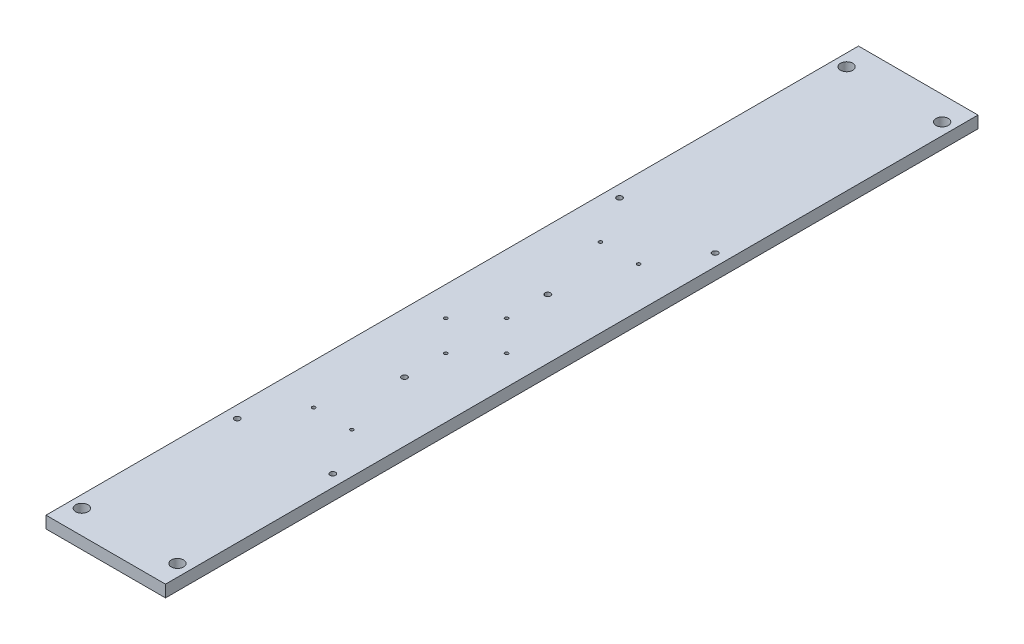
ISO-10303-21;
HEADER;
FILE_DESCRIPTION(('STEP AP214'),'2;1');
FILE_NAME('part.step','',(''),(''),'','','');
FILE_SCHEMA(('AUTOMOTIVE_DESIGN { 1 0 10303 214 1 1 1 1 }'));
ENDSEC;
DATA;
#1=APPLICATION_CONTEXT('core data for automotive mechanical design processes');
#2=APPLICATION_PROTOCOL_DEFINITION('international standard','automotive_design',2000,#1);
#3=PRODUCT_CONTEXT('',#1,'mechanical');
#4=PRODUCT('Part','Part','',(#3));
#5=PRODUCT_RELATED_PRODUCT_CATEGORY('part','',(#4));
#6=PRODUCT_DEFINITION_FORMATION('','',#4);
#7=PRODUCT_DEFINITION_CONTEXT('part definition',#1,'design');
#8=PRODUCT_DEFINITION('design','',#6,#7);
#9=PRODUCT_DEFINITION_SHAPE('','',#8);
#10=(LENGTH_UNIT() NAMED_UNIT(*) SI_UNIT(.MILLI.,.METRE.));
#11=(NAMED_UNIT(*) PLANE_ANGLE_UNIT() SI_UNIT($,.RADIAN.));
#12=(NAMED_UNIT(*) SI_UNIT($,.STERADIAN.) SOLID_ANGLE_UNIT());
#13=UNCERTAINTY_MEASURE_WITH_UNIT(LENGTH_MEASURE(1.E-05),#10,'distance_accuracy_value','');
#14=(GEOMETRIC_REPRESENTATION_CONTEXT(3) GLOBAL_UNCERTAINTY_ASSIGNED_CONTEXT((#13)) GLOBAL_UNIT_ASSIGNED_CONTEXT((#10,
#11,#12)) REPRESENTATION_CONTEXT('',''));
#15=CARTESIAN_POINT('',(0.,0.,0.));
#16=DIRECTION('',(0.,0.,1.));
#17=DIRECTION('',(1.,0.,0.));
#18=AXIS2_PLACEMENT_3D('',#15,#16,#17);
#19=CARTESIAN_POINT('',(0.,6.35,0.));
#20=DIRECTION('',(1.,0.,0.));
#21=DIRECTION('',(0.,0.,-1.));
#22=AXIS2_PLACEMENT_3D('',#19,#20,#21);
#23=PLANE('',#22);
#24=DIRECTION('',(0.,0.,1.));
#25=VECTOR('',#24,1.);
#26=CARTESIAN_POINT('',(0.,0.,0.));
#27=LINE('',#26,#25);
#28=CARTESIAN_POINT('',(0.,0.,-431.8));
#29=VERTEX_POINT('',#28);
#30=CARTESIAN_POINT('',(0.,0.,0.));
#31=VERTEX_POINT('',#30);
#32=EDGE_CURVE('E96',#29,#31,#27,.T.);
#33=ORIENTED_EDGE('',*,*,#32,.T.);
#34=DIRECTION('',(0.,-1.,0.));
#35=VECTOR('',#34,1.);
#36=CARTESIAN_POINT('',(0.,6.35,0.));
#37=LINE('',#36,#35);
#38=CARTESIAN_POINT('',(0.,6.35,0.));
#39=VERTEX_POINT('',#38);
#40=EDGE_CURVE('E11',#39,#31,#37,.T.);
#41=ORIENTED_EDGE('',*,*,#40,.F.);
#42=DIRECTION('',(0.,0.,1.));
#43=VECTOR('',#42,1.);
#44=CARTESIAN_POINT('',(0.,6.35,0.));
#45=LINE('',#44,#43);
#46=CARTESIAN_POINT('',(0.,6.35,-431.8));
#47=VERTEX_POINT('',#46);
#48=EDGE_CURVE('E84',#47,#39,#45,.T.);
#49=ORIENTED_EDGE('',*,*,#48,.F.);
#50=DIRECTION('',(0.,-1.,0.));
#51=VECTOR('',#50,1.);
#52=CARTESIAN_POINT('',(0.,6.35,-431.8));
#53=LINE('',#52,#51);
#54=EDGE_CURVE('E92',#47,#29,#53,.T.);
#55=ORIENTED_EDGE('',*,*,#54,.T.);
#56=EDGE_LOOP('',(#33,#41,#49,#55));
#57=FACE_BOUND('',#56,.T.);
#58=ADVANCED_FACE('F33',(#57),#23,.F.);
#59=CARTESIAN_POINT('',(0.,6.35,0.));
#60=DIRECTION('',(0.,0.,-1.));
#61=DIRECTION('',(-1.,0.,0.));
#62=AXIS2_PLACEMENT_3D('',#59,#60,#61);
#63=PLANE('',#62);
#64=DIRECTION('',(1.,0.,0.));
#65=VECTOR('',#64,1.);
#66=CARTESIAN_POINT('',(0.,0.,0.));
#67=LINE('',#66,#65);
#68=CARTESIAN_POINT('',(63.5,0.,0.));
#69=VERTEX_POINT('',#68);
#70=EDGE_CURVE('E88',#31,#69,#67,.T.);
#71=ORIENTED_EDGE('',*,*,#70,.T.);
#72=DIRECTION('',(0.,-1.,0.));
#73=VECTOR('',#72,1.);
#74=CARTESIAN_POINT('',(63.5,6.35,0.));
#75=LINE('',#74,#73);
#76=CARTESIAN_POINT('',(63.5,6.35,0.));
#77=VERTEX_POINT('',#76);
#78=EDGE_CURVE('E41',#77,#69,#75,.T.);
#79=ORIENTED_EDGE('',*,*,#78,.F.);
#80=DIRECTION('',(1.,0.,0.));
#81=VECTOR('',#80,1.);
#82=CARTESIAN_POINT('',(0.,6.35,0.));
#83=LINE('',#82,#81);
#84=EDGE_CURVE('E79',#39,#77,#83,.T.);
#85=ORIENTED_EDGE('',*,*,#84,.F.);
#86=ORIENTED_EDGE('',*,*,#40,.T.);
#87=EDGE_LOOP('',(#71,#79,#85,#86));
#88=FACE_BOUND('',#87,.T.);
#89=ADVANCED_FACE('F87',(#88),#63,.F.);
#90=CARTESIAN_POINT('',(63.5,6.35,0.));
#91=DIRECTION('',(-1.,0.,0.));
#92=DIRECTION('',(0.,0.,1.));
#93=AXIS2_PLACEMENT_3D('',#90,#91,#92);
#94=PLANE('',#93);
#95=DIRECTION('',(0.,0.,-1.));
#96=VECTOR('',#95,1.);
#97=CARTESIAN_POINT('',(63.5,0.,0.));
#98=LINE('',#97,#96);
#99=CARTESIAN_POINT('',(63.5,0.,-431.8));
#100=VERTEX_POINT('',#99);
#101=EDGE_CURVE('E66',#69,#100,#98,.T.);
#102=ORIENTED_EDGE('',*,*,#101,.T.);
#103=DIRECTION('',(0.,-1.,0.));
#104=VECTOR('',#103,1.);
#105=CARTESIAN_POINT('',(63.5,6.35,-431.8));
#106=LINE('',#105,#104);
#107=CARTESIAN_POINT('',(63.5,6.35,-431.8));
#108=VERTEX_POINT('',#107);
#109=EDGE_CURVE('E89',#108,#100,#106,.T.);
#110=ORIENTED_EDGE('',*,*,#109,.F.);
#111=DIRECTION('',(0.,0.,-1.));
#112=VECTOR('',#111,1.);
#113=CARTESIAN_POINT('',(63.5,6.35,0.));
#114=LINE('',#113,#112);
#115=EDGE_CURVE('E82',#77,#108,#114,.T.);
#116=ORIENTED_EDGE('',*,*,#115,.F.);
#117=ORIENTED_EDGE('',*,*,#78,.T.);
#118=EDGE_LOOP('',(#102,#110,#116,#117));
#119=FACE_BOUND('',#118,.T.);
#120=ADVANCED_FACE('F90',(#119),#94,.F.);
#121=CARTESIAN_POINT('',(0.,6.35,-431.8));
#122=DIRECTION('',(0.,0.,1.));
#123=DIRECTION('',(1.,0.,0.));
#124=AXIS2_PLACEMENT_3D('',#121,#122,#123);
#125=PLANE('',#124);
#126=DIRECTION('',(-1.,0.,0.));
#127=VECTOR('',#126,1.);
#128=CARTESIAN_POINT('',(0.,0.,-431.8));
#129=LINE('',#128,#127);
#130=EDGE_CURVE('E72',#100,#29,#129,.T.);
#131=ORIENTED_EDGE('',*,*,#130,.T.);
#132=ORIENTED_EDGE('',*,*,#54,.F.);
#133=DIRECTION('',(-1.,0.,0.));
#134=VECTOR('',#133,1.);
#135=CARTESIAN_POINT('',(0.,6.35,-431.8));
#136=LINE('',#135,#134);
#137=EDGE_CURVE('E49',#108,#47,#136,.T.);
#138=ORIENTED_EDGE('',*,*,#137,.F.);
#139=ORIENTED_EDGE('',*,*,#109,.T.);
#140=EDGE_LOOP('',(#131,#132,#138,#139));
#141=FACE_BOUND('',#140,.T.);
#142=ADVANCED_FACE('F104',(#141),#125,.F.);
#143=CARTESIAN_POINT('',(0.,6.35,0.));
#144=DIRECTION('',(0.,-1.,0.));
#145=DIRECTION('',(0.,0.,-1.));
#146=AXIS2_PLACEMENT_3D('',#143,#144,#145);
#147=PLANE('',#146);
#148=CARTESIAN_POINT('',(15.58544,6.35,-196.85));
#149=DIRECTION('',(0.,1.,0.));
#150=DIRECTION('',(0.,0.,1.));
#151=AXIS2_PLACEMENT_3D('',#148,#149,#150);
#152=CIRCLE('',#151,0.889000000000006);
#153=CARTESIAN_POINT('',(15.58544,6.35,-195.961));
#154=VERTEX_POINT('',#153);
#155=EDGE_CURVE('E195',#154,#154,#152,.T.);
#156=ORIENTED_EDGE('',*,*,#155,.F.);
#157=EDGE_LOOP('',(#156));
#158=FACE_BOUND('',#157,.T.);
#159=CARTESIAN_POINT('',(21.59,6.35,-120.65));
#160=DIRECTION('',(0.,1.,0.));
#161=DIRECTION('',(0.,0.,-1.));
#162=AXIS2_PLACEMENT_3D('',#159,#160,#161);
#163=CIRCLE('',#162,0.888999999999988);
#164=CARTESIAN_POINT('',(21.59,6.35,-121.539));
#165=VERTEX_POINT('',#164);
#166=EDGE_CURVE('E196',#165,#165,#163,.T.);
#167=ORIENTED_EDGE('',*,*,#166,.F.);
#168=EDGE_LOOP('',(#167));
#169=FACE_BOUND('',#168,.T.);
#170=CARTESIAN_POINT('',(41.9099999999999,6.35,-120.65));
#171=DIRECTION('',(0.,1.,0.));
#172=DIRECTION('',(0.,0.,1.));
#173=AXIS2_PLACEMENT_3D('',#170,#171,#172);
#174=CIRCLE('',#173,0.888999999999985);
#175=CARTESIAN_POINT('',(41.9099999999999,6.35,-119.761));
#176=VERTEX_POINT('',#175);
#177=EDGE_CURVE('E202',#176,#176,#174,.T.);
#178=ORIENTED_EDGE('',*,*,#177,.F.);
#179=EDGE_LOOP('',(#178));
#180=FACE_BOUND('',#179,.T.);
#181=CARTESIAN_POINT('',(41.9099999999999,6.35,-273.05));
#182=DIRECTION('',(0.,1.,0.));
#183=DIRECTION('',(0.,0.,-1.));
#184=AXIS2_PLACEMENT_3D('',#181,#182,#183);
#185=CIRCLE('',#184,0.888999999999985);
#186=CARTESIAN_POINT('',(41.9099999999999,6.35,-273.939));
#187=VERTEX_POINT('',#186);
#188=EDGE_CURVE('E208',#187,#187,#185,.T.);
#189=ORIENTED_EDGE('',*,*,#188,.F.);
#190=EDGE_LOOP('',(#189));
#191=FACE_BOUND('',#190,.T.);
#192=CARTESIAN_POINT('',(31.7500000000053,6.35,-180.685439999995));
#193=DIRECTION('',(0.,1.,0.));
#194=DIRECTION('',(0.,0.,1.));
#195=AXIS2_PLACEMENT_3D('',#192,#193,#194);
#196=CIRCLE('',#195,0.88900000000002);
#197=CARTESIAN_POINT('',(31.7500000000053,6.35,-179.796439999994));
#198=VERTEX_POINT('',#197);
#199=EDGE_CURVE('E170',#198,#198,#196,.T.);
#200=ORIENTED_EDGE('',*,*,#199,.F.);
#201=EDGE_LOOP('',(#200));
#202=FACE_BOUND('',#201,.T.);
#203=CARTESIAN_POINT('',(47.914560000011,6.35,-196.85));
#204=DIRECTION('',(0.,1.,0.));
#205=DIRECTION('',(0.,0.,1.));
#206=AXIS2_PLACEMENT_3D('',#203,#204,#205);
#207=CIRCLE('',#206,0.889000000000006);
#208=CARTESIAN_POINT('',(47.914560000011,6.35,-195.961));
#209=VERTEX_POINT('',#208);
#210=EDGE_CURVE('E177',#209,#209,#207,.T.);
#211=ORIENTED_EDGE('',*,*,#210,.F.);
#212=EDGE_LOOP('',(#211));
#213=FACE_BOUND('',#212,.T.);
#214=CARTESIAN_POINT('',(31.7500000000055,6.35,-213.014560000005));
#215=DIRECTION('',(0.,1.,0.));
#216=DIRECTION('',(0.,0.,1.));
#217=AXIS2_PLACEMENT_3D('',#214,#215,#216);
#218=CIRCLE('',#217,0.888999999999993);
#219=CARTESIAN_POINT('',(31.7500000000055,6.35,-212.125560000005));
#220=VERTEX_POINT('',#219);
#221=EDGE_CURVE('E183',#220,#220,#218,.T.);
#222=ORIENTED_EDGE('',*,*,#221,.F.);
#223=EDGE_LOOP('',(#222));
#224=FACE_BOUND('',#223,.T.);
#225=CARTESIAN_POINT('',(21.59,6.35,-273.05));
#226=DIRECTION('',(0.,1.,0.));
#227=DIRECTION('',(0.,0.,1.));
#228=AXIS2_PLACEMENT_3D('',#225,#226,#227);
#229=CIRCLE('',#228,0.888999999999988);
#230=CARTESIAN_POINT('',(21.59,6.35,-272.161));
#231=VERTEX_POINT('',#230);
#232=EDGE_CURVE('E189',#231,#231,#229,.T.);
#233=ORIENTED_EDGE('',*,*,#232,.F.);
#234=EDGE_LOOP('',(#233));
#235=FACE_BOUND('',#234,.T.);
#236=CARTESIAN_POINT('',(57.1499999999999,6.35,-298.45));
#237=DIRECTION('',(0.,1.,0.));
#238=DIRECTION('',(0.,0.,-1.));
#239=AXIS2_PLACEMENT_3D('',#236,#237,#238);
#240=CIRCLE('',#239,1.47319999999999);
#241=CARTESIAN_POINT('',(57.1499999999999,6.35,-299.9232));
#242=VERTEX_POINT('',#241);
#243=EDGE_CURVE('E159',#242,#242,#240,.T.);
#244=ORIENTED_EDGE('',*,*,#243,.F.);
#245=EDGE_LOOP('',(#244));
#246=FACE_BOUND('',#245,.T.);
#247=CARTESIAN_POINT('',(57.1499999999999,6.35,-95.25));
#248=DIRECTION('',(0.,1.,0.));
#249=DIRECTION('',(0.,0.,1.));
#250=AXIS2_PLACEMENT_3D('',#247,#248,#249);
#251=CIRCLE('',#250,1.47319999999999);
#252=CARTESIAN_POINT('',(57.1499999999999,6.35,-93.7768));
#253=VERTEX_POINT('',#252);
#254=EDGE_CURVE('E153',#253,#253,#251,.T.);
#255=ORIENTED_EDGE('',*,*,#254,.F.);
#256=EDGE_LOOP('',(#255));
#257=FACE_BOUND('',#256,.T.);
#258=CARTESIAN_POINT('',(6.35,6.35,-95.25));
#259=DIRECTION('',(0.,1.,0.));
#260=DIRECTION('',(0.,0.,-1.));
#261=AXIS2_PLACEMENT_3D('',#258,#259,#260);
#262=CIRCLE('',#261,1.47319999999999);
#263=CARTESIAN_POINT('',(6.35,6.35,-96.7232));
#264=VERTEX_POINT('',#263);
#265=EDGE_CURVE('E147',#264,#264,#262,.T.);
#266=ORIENTED_EDGE('',*,*,#265,.F.);
#267=EDGE_LOOP('',(#266));
#268=FACE_BOUND('',#267,.T.);
#269=CARTESIAN_POINT('',(31.75,6.35,-234.95));
#270=DIRECTION('',(0.,1.,0.));
#271=DIRECTION('',(0.,0.,1.));
#272=AXIS2_PLACEMENT_3D('',#269,#270,#271);
#273=CIRCLE('',#272,1.47319999999998);
#274=CARTESIAN_POINT('',(31.75,6.35,-233.4768));
#275=VERTEX_POINT('',#274);
#276=EDGE_CURVE('E140',#275,#275,#273,.T.);
#277=ORIENTED_EDGE('',*,*,#276,.F.);
#278=EDGE_LOOP('',(#277));
#279=FACE_BOUND('',#278,.T.);
#280=CARTESIAN_POINT('',(31.75,6.35,-158.75));
#281=DIRECTION('',(0.,1.,0.));
#282=DIRECTION('',(0.,0.,-1.));
#283=AXIS2_PLACEMENT_3D('',#280,#281,#282);
#284=CIRCLE('',#283,1.47319999999998);
#285=CARTESIAN_POINT('',(31.75,6.35,-160.2232));
#286=VERTEX_POINT('',#285);
#287=EDGE_CURVE('E164',#286,#286,#284,.T.);
#288=ORIENTED_EDGE('',*,*,#287,.F.);
#289=EDGE_LOOP('',(#288));
#290=FACE_BOUND('',#289,.T.);
#291=CARTESIAN_POINT('',(6.35,6.35,-298.45));
#292=DIRECTION('',(0.,1.,0.));
#293=DIRECTION('',(0.,0.,1.));
#294=AXIS2_PLACEMENT_3D('',#291,#292,#293);
#295=CIRCLE('',#294,1.47319999999999);
#296=CARTESIAN_POINT('',(6.35,6.35,-296.9768));
#297=VERTEX_POINT('',#296);
#298=EDGE_CURVE('E134',#297,#297,#295,.T.);
#299=ORIENTED_EDGE('',*,*,#298,.F.);
#300=EDGE_LOOP('',(#299));
#301=FACE_BOUND('',#300,.T.);
#302=CARTESIAN_POINT('',(6.35,6.35,-12.7));
#303=DIRECTION('',(0.,1.,0.));
#304=DIRECTION('',(0.,0.,-1.));
#305=AXIS2_PLACEMENT_3D('',#302,#303,#304);
#306=CIRCLE('',#305,3.26390000000003);
#307=CARTESIAN_POINT('',(6.35,6.35,-15.9639));
#308=VERTEX_POINT('',#307);
#309=EDGE_CURVE('E116',#308,#308,#306,.T.);
#310=ORIENTED_EDGE('',*,*,#309,.F.);
#311=EDGE_LOOP('',(#310));
#312=FACE_BOUND('',#311,.T.);
#313=CARTESIAN_POINT('',(57.15,6.35,-12.7));
#314=DIRECTION('',(0.,1.,0.));
#315=DIRECTION('',(0.,0.,1.));
#316=AXIS2_PLACEMENT_3D('',#313,#314,#315);
#317=CIRCLE('',#316,3.26390000000003);
#318=CARTESIAN_POINT('',(57.15,6.35,-9.43609999999996));
#319=VERTEX_POINT('',#318);
#320=EDGE_CURVE('E123',#319,#319,#317,.T.);
#321=ORIENTED_EDGE('',*,*,#320,.F.);
#322=EDGE_LOOP('',(#321));
#323=FACE_BOUND('',#322,.T.);
#324=CARTESIAN_POINT('',(57.15,6.35,-419.1));
#325=DIRECTION('',(0.,1.,0.));
#326=DIRECTION('',(0.,0.,-1.));
#327=AXIS2_PLACEMENT_3D('',#324,#325,#326);
#328=CIRCLE('',#327,3.26390000000003);
#329=CARTESIAN_POINT('',(57.15,6.35,-422.3639));
#330=VERTEX_POINT('',#329);
#331=EDGE_CURVE('E129',#330,#330,#328,.T.);
#332=ORIENTED_EDGE('',*,*,#331,.F.);
#333=EDGE_LOOP('',(#332));
#334=FACE_BOUND('',#333,.T.);
#335=CARTESIAN_POINT('',(6.35,6.35,-419.1));
#336=DIRECTION('',(0.,1.,0.));
#337=DIRECTION('',(0.,0.,1.));
#338=AXIS2_PLACEMENT_3D('',#335,#336,#337);
#339=CIRCLE('',#338,3.26390000000003);
#340=CARTESIAN_POINT('',(6.35,6.35,-415.8361));
#341=VERTEX_POINT('',#340);
#342=EDGE_CURVE('E110',#341,#341,#339,.T.);
#343=ORIENTED_EDGE('',*,*,#342,.F.);
#344=EDGE_LOOP('',(#343));
#345=FACE_BOUND('',#344,.T.);
#346=ORIENTED_EDGE('',*,*,#48,.T.);
#347=ORIENTED_EDGE('',*,*,#84,.T.);
#348=ORIENTED_EDGE('',*,*,#115,.T.);
#349=ORIENTED_EDGE('',*,*,#137,.T.);
#350=EDGE_LOOP('',(#346,#347,#348,#349));
#351=FACE_BOUND('',#350,.T.);
#352=ADVANCED_FACE('F80',(#158,#169,#180,#191,#202,#213,#224,#235,#246,#257,#268,#279,#290,#301,
#312,#323,#334,#345,#351),#147,.F.);
#353=CARTESIAN_POINT('',(0.,0.,0.));
#354=DIRECTION('',(0.,-1.,0.));
#355=DIRECTION('',(0.,0.,-1.));
#356=AXIS2_PLACEMENT_3D('',#353,#354,#355);
#357=PLANE('',#356);
#358=CARTESIAN_POINT('',(15.58544,0.,-196.85));
#359=DIRECTION('',(0.,1.,0.));
#360=DIRECTION('',(0.,0.,1.));
#361=AXIS2_PLACEMENT_3D('',#358,#359,#360);
#362=CIRCLE('',#361,0.889000000000006);
#363=CARTESIAN_POINT('',(15.58544,0.,-195.961));
#364=VERTEX_POINT('',#363);
#365=EDGE_CURVE('E167',#364,#364,#362,.T.);
#366=ORIENTED_EDGE('',*,*,#365,.T.);
#367=EDGE_LOOP('',(#366));
#368=FACE_BOUND('',#367,.T.);
#369=CARTESIAN_POINT('',(21.59,0.,-120.65));
#370=DIRECTION('',(0.,1.,0.));
#371=DIRECTION('',(0.,0.,-1.));
#372=AXIS2_PLACEMENT_3D('',#369,#370,#371);
#373=CIRCLE('',#372,0.888999999999988);
#374=CARTESIAN_POINT('',(21.59,0.,-121.539));
#375=VERTEX_POINT('',#374);
#376=EDGE_CURVE('E199',#375,#375,#373,.T.);
#377=ORIENTED_EDGE('',*,*,#376,.T.);
#378=EDGE_LOOP('',(#377));
#379=FACE_BOUND('',#378,.T.);
#380=CARTESIAN_POINT('',(41.9099999999999,0.,-120.65));
#381=DIRECTION('',(0.,1.,0.));
#382=DIRECTION('',(0.,0.,1.));
#383=AXIS2_PLACEMENT_3D('',#380,#381,#382);
#384=CIRCLE('',#383,0.888999999999985);
#385=CARTESIAN_POINT('',(41.9099999999999,0.,-119.761));
#386=VERTEX_POINT('',#385);
#387=EDGE_CURVE('E205',#386,#386,#384,.T.);
#388=ORIENTED_EDGE('',*,*,#387,.T.);
#389=EDGE_LOOP('',(#388));
#390=FACE_BOUND('',#389,.T.);
#391=CARTESIAN_POINT('',(41.9099999999999,0.,-273.05));
#392=DIRECTION('',(0.,1.,0.));
#393=DIRECTION('',(0.,0.,-1.));
#394=AXIS2_PLACEMENT_3D('',#391,#392,#393);
#395=CIRCLE('',#394,0.888999999999985);
#396=CARTESIAN_POINT('',(41.9099999999999,0.,-273.939));
#397=VERTEX_POINT('',#396);
#398=EDGE_CURVE('E174',#397,#397,#395,.T.);
#399=ORIENTED_EDGE('',*,*,#398,.T.);
#400=EDGE_LOOP('',(#399));
#401=FACE_BOUND('',#400,.T.);
#402=CARTESIAN_POINT('',(31.7500000000053,0.,-180.685439999995));
#403=DIRECTION('',(0.,1.,0.));
#404=DIRECTION('',(0.,0.,1.));
#405=AXIS2_PLACEMENT_3D('',#402,#403,#404);
#406=CIRCLE('',#405,0.88900000000002);
#407=CARTESIAN_POINT('',(31.7500000000053,0.,-179.796439999994));
#408=VERTEX_POINT('',#407);
#409=EDGE_CURVE('E173',#408,#408,#406,.T.);
#410=ORIENTED_EDGE('',*,*,#409,.T.);
#411=EDGE_LOOP('',(#410));
#412=FACE_BOUND('',#411,.T.);
#413=CARTESIAN_POINT('',(47.914560000011,0.,-196.85));
#414=DIRECTION('',(0.,1.,0.));
#415=DIRECTION('',(0.,0.,1.));
#416=AXIS2_PLACEMENT_3D('',#413,#414,#415);
#417=CIRCLE('',#416,0.889000000000006);
#418=CARTESIAN_POINT('',(47.914560000011,0.,-195.961));
#419=VERTEX_POINT('',#418);
#420=EDGE_CURVE('E180',#419,#419,#417,.T.);
#421=ORIENTED_EDGE('',*,*,#420,.T.);
#422=EDGE_LOOP('',(#421));
#423=FACE_BOUND('',#422,.T.);
#424=CARTESIAN_POINT('',(31.7500000000055,0.,-213.014560000005));
#425=DIRECTION('',(0.,1.,0.));
#426=DIRECTION('',(0.,0.,1.));
#427=AXIS2_PLACEMENT_3D('',#424,#425,#426);
#428=CIRCLE('',#427,0.888999999999993);
#429=CARTESIAN_POINT('',(31.7500000000055,0.,-212.125560000005));
#430=VERTEX_POINT('',#429);
#431=EDGE_CURVE('E186',#430,#430,#428,.T.);
#432=ORIENTED_EDGE('',*,*,#431,.T.);
#433=EDGE_LOOP('',(#432));
#434=FACE_BOUND('',#433,.T.);
#435=CARTESIAN_POINT('',(21.59,0.,-273.05));
#436=DIRECTION('',(0.,1.,0.));
#437=DIRECTION('',(0.,0.,1.));
#438=AXIS2_PLACEMENT_3D('',#435,#436,#437);
#439=CIRCLE('',#438,0.888999999999988);
#440=CARTESIAN_POINT('',(21.59,0.,-272.161));
#441=VERTEX_POINT('',#440);
#442=EDGE_CURVE('E192',#441,#441,#439,.T.);
#443=ORIENTED_EDGE('',*,*,#442,.T.);
#444=EDGE_LOOP('',(#443));
#445=FACE_BOUND('',#444,.T.);
#446=CARTESIAN_POINT('',(57.1499999999999,0.,-298.45));
#447=DIRECTION('',(0.,1.,0.));
#448=DIRECTION('',(0.,0.,-1.));
#449=AXIS2_PLACEMENT_3D('',#446,#447,#448);
#450=CIRCLE('',#449,1.47319999999999);
#451=CARTESIAN_POINT('',(57.1499999999999,0.,-299.9232));
#452=VERTEX_POINT('',#451);
#453=EDGE_CURVE('E137',#452,#452,#450,.T.);
#454=ORIENTED_EDGE('',*,*,#453,.T.);
#455=EDGE_LOOP('',(#454));
#456=FACE_BOUND('',#455,.T.);
#457=CARTESIAN_POINT('',(57.1499999999999,0.,-95.25));
#458=DIRECTION('',(0.,1.,0.));
#459=DIRECTION('',(0.,0.,1.));
#460=AXIS2_PLACEMENT_3D('',#457,#458,#459);
#461=CIRCLE('',#460,1.47319999999999);
#462=CARTESIAN_POINT('',(57.1499999999999,0.,-93.7768));
#463=VERTEX_POINT('',#462);
#464=EDGE_CURVE('E156',#463,#463,#461,.T.);
#465=ORIENTED_EDGE('',*,*,#464,.T.);
#466=EDGE_LOOP('',(#465));
#467=FACE_BOUND('',#466,.T.);
#468=CARTESIAN_POINT('',(6.35,0.,-95.25));
#469=DIRECTION('',(0.,1.,0.));
#470=DIRECTION('',(0.,0.,-1.));
#471=AXIS2_PLACEMENT_3D('',#468,#469,#470);
#472=CIRCLE('',#471,1.47319999999999);
#473=CARTESIAN_POINT('',(6.35,0.,-96.7232));
#474=VERTEX_POINT('',#473);
#475=EDGE_CURVE('E150',#474,#474,#472,.T.);
#476=ORIENTED_EDGE('',*,*,#475,.T.);
#477=EDGE_LOOP('',(#476));
#478=FACE_BOUND('',#477,.T.);
#479=CARTESIAN_POINT('',(31.75,0.,-234.95));
#480=DIRECTION('',(0.,1.,0.));
#481=DIRECTION('',(0.,0.,1.));
#482=AXIS2_PLACEMENT_3D('',#479,#480,#481);
#483=CIRCLE('',#482,1.47319999999998);
#484=CARTESIAN_POINT('',(31.75,0.,-233.4768));
#485=VERTEX_POINT('',#484);
#486=EDGE_CURVE('E143',#485,#485,#483,.T.);
#487=ORIENTED_EDGE('',*,*,#486,.T.);
#488=EDGE_LOOP('',(#487));
#489=FACE_BOUND('',#488,.T.);
#490=CARTESIAN_POINT('',(31.75,0.,-158.75));
#491=DIRECTION('',(0.,1.,0.));
#492=DIRECTION('',(0.,0.,-1.));
#493=AXIS2_PLACEMENT_3D('',#490,#491,#492);
#494=CIRCLE('',#493,1.47319999999998);
#495=CARTESIAN_POINT('',(31.75,0.,-160.2232));
#496=VERTEX_POINT('',#495);
#497=EDGE_CURVE('E144',#496,#496,#494,.T.);
#498=ORIENTED_EDGE('',*,*,#497,.T.);
#499=EDGE_LOOP('',(#498));
#500=FACE_BOUND('',#499,.T.);
#501=CARTESIAN_POINT('',(6.35,0.,-298.45));
#502=DIRECTION('',(0.,1.,0.));
#503=DIRECTION('',(0.,0.,1.));
#504=AXIS2_PLACEMENT_3D('',#501,#502,#503);
#505=CIRCLE('',#504,1.47319999999999);
#506=CARTESIAN_POINT('',(6.35,0.,-296.9768));
#507=VERTEX_POINT('',#506);
#508=EDGE_CURVE('E120',#507,#507,#505,.T.);
#509=ORIENTED_EDGE('',*,*,#508,.T.);
#510=EDGE_LOOP('',(#509));
#511=FACE_BOUND('',#510,.T.);
#512=CARTESIAN_POINT('',(6.35,0.,-12.7));
#513=DIRECTION('',(0.,1.,0.));
#514=DIRECTION('',(0.,0.,-1.));
#515=AXIS2_PLACEMENT_3D('',#512,#513,#514);
#516=CIRCLE('',#515,3.26390000000003);
#517=CARTESIAN_POINT('',(6.35,0.,-15.9639));
#518=VERTEX_POINT('',#517);
#519=EDGE_CURVE('E119',#518,#518,#516,.T.);
#520=ORIENTED_EDGE('',*,*,#519,.T.);
#521=EDGE_LOOP('',(#520));
#522=FACE_BOUND('',#521,.T.);
#523=CARTESIAN_POINT('',(57.15,0.,-12.7));
#524=DIRECTION('',(0.,1.,0.));
#525=DIRECTION('',(0.,0.,1.));
#526=AXIS2_PLACEMENT_3D('',#523,#524,#525);
#527=CIRCLE('',#526,3.26390000000003);
#528=CARTESIAN_POINT('',(57.15,0.,-9.43609999999996));
#529=VERTEX_POINT('',#528);
#530=EDGE_CURVE('E126',#529,#529,#527,.T.);
#531=ORIENTED_EDGE('',*,*,#530,.T.);
#532=EDGE_LOOP('',(#531));
#533=FACE_BOUND('',#532,.T.);
#534=CARTESIAN_POINT('',(57.15,0.,-419.1));
#535=DIRECTION('',(0.,1.,0.));
#536=DIRECTION('',(0.,0.,-1.));
#537=AXIS2_PLACEMENT_3D('',#534,#535,#536);
#538=CIRCLE('',#537,3.26390000000003);
#539=CARTESIAN_POINT('',(57.15,0.,-422.3639));
#540=VERTEX_POINT('',#539);
#541=EDGE_CURVE('E113',#540,#540,#538,.T.);
#542=ORIENTED_EDGE('',*,*,#541,.T.);
#543=EDGE_LOOP('',(#542));
#544=FACE_BOUND('',#543,.T.);
#545=CARTESIAN_POINT('',(6.35,0.,-419.1));
#546=DIRECTION('',(0.,1.,0.));
#547=DIRECTION('',(0.,0.,1.));
#548=AXIS2_PLACEMENT_3D('',#545,#546,#547);
#549=CIRCLE('',#548,3.26390000000003);
#550=CARTESIAN_POINT('',(6.35,0.,-415.8361));
#551=VERTEX_POINT('',#550);
#552=EDGE_CURVE('E99',#551,#551,#549,.T.);
#553=ORIENTED_EDGE('',*,*,#552,.T.);
#554=EDGE_LOOP('',(#553));
#555=FACE_BOUND('',#554,.T.);
#556=ORIENTED_EDGE('',*,*,#32,.F.);
#557=ORIENTED_EDGE('',*,*,#130,.F.);
#558=ORIENTED_EDGE('',*,*,#101,.F.);
#559=ORIENTED_EDGE('',*,*,#70,.F.);
#560=EDGE_LOOP('',(#556,#557,#558,#559));
#561=FACE_BOUND('',#560,.T.);
#562=ADVANCED_FACE('F107',(#368,#379,#390,#401,#412,#423,#434,#445,#456,#467,#478,#489,#500,
#511,#522,#533,#544,#555,#561),#357,.T.);
#563=CARTESIAN_POINT('',(6.35,0.,-419.1));
#564=DIRECTION('',(0.,1.,0.));
#565=DIRECTION('',(0.,0.,1.));
#566=AXIS2_PLACEMENT_3D('',#563,#564,#565);
#567=CYLINDRICAL_SURFACE('',#566,3.26390000000003);
#568=ORIENTED_EDGE('',*,*,#552,.F.);
#569=EDGE_LOOP('',(#568));
#570=FACE_BOUND('',#569,.T.);
#571=ORIENTED_EDGE('',*,*,#342,.T.);
#572=EDGE_LOOP('',(#571));
#573=FACE_BOUND('',#572,.T.);
#574=ADVANCED_FACE('F264',(#570,#573),#567,.F.);
#575=CARTESIAN_POINT('',(57.15,0.,-419.1));
#576=DIRECTION('',(0.,1.,0.));
#577=DIRECTION('',(0.,0.,1.));
#578=AXIS2_PLACEMENT_3D('',#575,#576,#577);
#579=CYLINDRICAL_SURFACE('',#578,3.26390000000003);
#580=ORIENTED_EDGE('',*,*,#541,.F.);
#581=EDGE_LOOP('',(#580));
#582=FACE_BOUND('',#581,.T.);
#583=ORIENTED_EDGE('',*,*,#331,.T.);
#584=EDGE_LOOP('',(#583));
#585=FACE_BOUND('',#584,.T.);
#586=ADVANCED_FACE('F266',(#582,#585),#579,.F.);
#587=CARTESIAN_POINT('',(57.15,0.,-12.7));
#588=DIRECTION('',(0.,1.,0.));
#589=DIRECTION('',(0.,0.,1.));
#590=AXIS2_PLACEMENT_3D('',#587,#588,#589);
#591=CYLINDRICAL_SURFACE('',#590,3.26390000000003);
#592=ORIENTED_EDGE('',*,*,#530,.F.);
#593=EDGE_LOOP('',(#592));
#594=FACE_BOUND('',#593,.T.);
#595=ORIENTED_EDGE('',*,*,#320,.T.);
#596=EDGE_LOOP('',(#595));
#597=FACE_BOUND('',#596,.T.);
#598=ADVANCED_FACE('F273',(#594,#597),#591,.F.);
#599=CARTESIAN_POINT('',(6.35,0.,-12.7));
#600=DIRECTION('',(0.,1.,0.));
#601=DIRECTION('',(0.,0.,1.));
#602=AXIS2_PLACEMENT_3D('',#599,#600,#601);
#603=CYLINDRICAL_SURFACE('',#602,3.26390000000003);
#604=ORIENTED_EDGE('',*,*,#519,.F.);
#605=EDGE_LOOP('',(#604));
#606=FACE_BOUND('',#605,.T.);
#607=ORIENTED_EDGE('',*,*,#309,.T.);
#608=EDGE_LOOP('',(#607));
#609=FACE_BOUND('',#608,.T.);
#610=ADVANCED_FACE('F410',(#606,#609),#603,.F.);
#611=CARTESIAN_POINT('',(6.35,0.,-298.45));
#612=DIRECTION('',(0.,1.,0.));
#613=DIRECTION('',(0.,0.,1.));
#614=AXIS2_PLACEMENT_3D('',#611,#612,#613);
#615=CYLINDRICAL_SURFACE('',#614,1.47319999999999);
#616=ORIENTED_EDGE('',*,*,#508,.F.);
#617=EDGE_LOOP('',(#616));
#618=FACE_BOUND('',#617,.T.);
#619=ORIENTED_EDGE('',*,*,#298,.T.);
#620=EDGE_LOOP('',(#619));
#621=FACE_BOUND('',#620,.T.);
#622=ADVANCED_FACE('F394',(#618,#621),#615,.F.);
#623=CARTESIAN_POINT('',(31.75,0.,-158.75));
#624=DIRECTION('',(0.,1.,0.));
#625=DIRECTION('',(0.,0.,1.));
#626=AXIS2_PLACEMENT_3D('',#623,#624,#625);
#627=CYLINDRICAL_SURFACE('',#626,1.47319999999998);
#628=ORIENTED_EDGE('',*,*,#497,.F.);
#629=EDGE_LOOP('',(#628));
#630=FACE_BOUND('',#629,.T.);
#631=ORIENTED_EDGE('',*,*,#287,.T.);
#632=EDGE_LOOP('',(#631));
#633=FACE_BOUND('',#632,.T.);
#634=ADVANCED_FACE('F390',(#630,#633),#627,.F.);
#635=CARTESIAN_POINT('',(31.75,0.,-234.95));
#636=DIRECTION('',(0.,1.,0.));
#637=DIRECTION('',(0.,0.,1.));
#638=AXIS2_PLACEMENT_3D('',#635,#636,#637);
#639=CYLINDRICAL_SURFACE('',#638,1.47319999999998);
#640=ORIENTED_EDGE('',*,*,#486,.F.);
#641=EDGE_LOOP('',(#640));
#642=FACE_BOUND('',#641,.T.);
#643=ORIENTED_EDGE('',*,*,#276,.T.);
#644=EDGE_LOOP('',(#643));
#645=FACE_BOUND('',#644,.T.);
#646=ADVANCED_FACE('F393',(#642,#645),#639,.F.);
#647=CARTESIAN_POINT('',(6.35,0.,-95.25));
#648=DIRECTION('',(0.,1.,0.));
#649=DIRECTION('',(0.,0.,1.));
#650=AXIS2_PLACEMENT_3D('',#647,#648,#649);
#651=CYLINDRICAL_SURFACE('',#650,1.47319999999999);
#652=ORIENTED_EDGE('',*,*,#475,.F.);
#653=EDGE_LOOP('',(#652));
#654=FACE_BOUND('',#653,.T.);
#655=ORIENTED_EDGE('',*,*,#265,.T.);
#656=EDGE_LOOP('',(#655));
#657=FACE_BOUND('',#656,.T.);
#658=ADVANCED_FACE('F401',(#654,#657),#651,.F.);
#659=CARTESIAN_POINT('',(57.1499999999999,0.,-95.25));
#660=DIRECTION('',(0.,1.,0.));
#661=DIRECTION('',(0.,0.,1.));
#662=AXIS2_PLACEMENT_3D('',#659,#660,#661);
#663=CYLINDRICAL_SURFACE('',#662,1.47319999999999);
#664=ORIENTED_EDGE('',*,*,#464,.F.);
#665=EDGE_LOOP('',(#664));
#666=FACE_BOUND('',#665,.T.);
#667=ORIENTED_EDGE('',*,*,#254,.T.);
#668=EDGE_LOOP('',(#667));
#669=FACE_BOUND('',#668,.T.);
#670=ADVANCED_FACE('F397',(#666,#669),#663,.F.);
#671=CARTESIAN_POINT('',(57.1499999999999,0.,-298.45));
#672=DIRECTION('',(0.,1.,0.));
#673=DIRECTION('',(0.,0.,1.));
#674=AXIS2_PLACEMENT_3D('',#671,#672,#673);
#675=CYLINDRICAL_SURFACE('',#674,1.47319999999999);
#676=ORIENTED_EDGE('',*,*,#453,.F.);
#677=EDGE_LOOP('',(#676));
#678=FACE_BOUND('',#677,.T.);
#679=ORIENTED_EDGE('',*,*,#243,.T.);
#680=EDGE_LOOP('',(#679));
#681=FACE_BOUND('',#680,.T.);
#682=ADVANCED_FACE('F316',(#678,#681),#675,.F.);
#683=CARTESIAN_POINT('',(21.59,0.,-273.05));
#684=DIRECTION('',(0.,1.,0.));
#685=DIRECTION('',(0.,0.,1.));
#686=AXIS2_PLACEMENT_3D('',#683,#684,#685);
#687=CYLINDRICAL_SURFACE('',#686,0.888999999999988);
#688=ORIENTED_EDGE('',*,*,#442,.F.);
#689=EDGE_LOOP('',(#688));
#690=FACE_BOUND('',#689,.T.);
#691=ORIENTED_EDGE('',*,*,#232,.T.);
#692=EDGE_LOOP('',(#691));
#693=FACE_BOUND('',#692,.T.);
#694=ADVANCED_FACE('F310',(#690,#693),#687,.F.);
#695=CARTESIAN_POINT('',(31.7500000000055,0.,-213.014560000005));
#696=DIRECTION('',(0.,1.,0.));
#697=DIRECTION('',(0.,0.,1.));
#698=AXIS2_PLACEMENT_3D('',#695,#696,#697);
#699=CYLINDRICAL_SURFACE('',#698,0.888999999999993);
#700=ORIENTED_EDGE('',*,*,#431,.F.);
#701=EDGE_LOOP('',(#700));
#702=FACE_BOUND('',#701,.T.);
#703=ORIENTED_EDGE('',*,*,#221,.T.);
#704=EDGE_LOOP('',(#703));
#705=FACE_BOUND('',#704,.T.);
#706=ADVANCED_FACE('F315',(#702,#705),#699,.F.);
#707=CARTESIAN_POINT('',(47.914560000011,0.,-196.85));
#708=DIRECTION('',(0.,1.,0.));
#709=DIRECTION('',(0.,0.,1.));
#710=AXIS2_PLACEMENT_3D('',#707,#708,#709);
#711=CYLINDRICAL_SURFACE('',#710,0.889000000000006);
#712=ORIENTED_EDGE('',*,*,#420,.F.);
#713=EDGE_LOOP('',(#712));
#714=FACE_BOUND('',#713,.T.);
#715=ORIENTED_EDGE('',*,*,#210,.T.);
#716=EDGE_LOOP('',(#715));
#717=FACE_BOUND('',#716,.T.);
#718=ADVANCED_FACE('F328',(#714,#717),#711,.F.);
#719=CARTESIAN_POINT('',(31.7500000000053,0.,-180.685439999995));
#720=DIRECTION('',(0.,1.,0.));
#721=DIRECTION('',(0.,0.,1.));
#722=AXIS2_PLACEMENT_3D('',#719,#720,#721);
#723=CYLINDRICAL_SURFACE('',#722,0.88900000000002);
#724=ORIENTED_EDGE('',*,*,#409,.F.);
#725=EDGE_LOOP('',(#724));
#726=FACE_BOUND('',#725,.T.);
#727=ORIENTED_EDGE('',*,*,#199,.T.);
#728=EDGE_LOOP('',(#727));
#729=FACE_BOUND('',#728,.T.);
#730=ADVANCED_FACE('F338',(#726,#729),#723,.F.);
#731=CARTESIAN_POINT('',(41.9099999999999,0.,-273.05));
#732=DIRECTION('',(0.,1.,0.));
#733=DIRECTION('',(0.,0.,1.));
#734=AXIS2_PLACEMENT_3D('',#731,#732,#733);
#735=CYLINDRICAL_SURFACE('',#734,0.888999999999985);
#736=ORIENTED_EDGE('',*,*,#398,.F.);
#737=EDGE_LOOP('',(#736));
#738=FACE_BOUND('',#737,.T.);
#739=ORIENTED_EDGE('',*,*,#188,.T.);
#740=EDGE_LOOP('',(#739));
#741=FACE_BOUND('',#740,.T.);
#742=ADVANCED_FACE('F348',(#738,#741),#735,.F.);
#743=CARTESIAN_POINT('',(41.9099999999999,0.,-120.65));
#744=DIRECTION('',(0.,1.,0.));
#745=DIRECTION('',(0.,0.,1.));
#746=AXIS2_PLACEMENT_3D('',#743,#744,#745);
#747=CYLINDRICAL_SURFACE('',#746,0.888999999999985);
#748=ORIENTED_EDGE('',*,*,#387,.F.);
#749=EDGE_LOOP('',(#748));
#750=FACE_BOUND('',#749,.T.);
#751=ORIENTED_EDGE('',*,*,#177,.T.);
#752=EDGE_LOOP('',(#751));
#753=FACE_BOUND('',#752,.T.);
#754=ADVANCED_FACE('F358',(#750,#753),#747,.F.);
#755=CARTESIAN_POINT('',(21.59,0.,-120.65));
#756=DIRECTION('',(0.,1.,0.));
#757=DIRECTION('',(0.,0.,1.));
#758=AXIS2_PLACEMENT_3D('',#755,#756,#757);
#759=CYLINDRICAL_SURFACE('',#758,0.888999999999988);
#760=ORIENTED_EDGE('',*,*,#376,.F.);
#761=EDGE_LOOP('',(#760));
#762=FACE_BOUND('',#761,.T.);
#763=ORIENTED_EDGE('',*,*,#166,.T.);
#764=EDGE_LOOP('',(#763));
#765=FACE_BOUND('',#764,.T.);
#766=ADVANCED_FACE('F223',(#762,#765),#759,.F.);
#767=CARTESIAN_POINT('',(15.58544,0.,-196.85));
#768=DIRECTION('',(0.,1.,0.));
#769=DIRECTION('',(0.,0.,1.));
#770=AXIS2_PLACEMENT_3D('',#767,#768,#769);
#771=CYLINDRICAL_SURFACE('',#770,0.889000000000006);
#772=ORIENTED_EDGE('',*,*,#365,.F.);
#773=EDGE_LOOP('',(#772));
#774=FACE_BOUND('',#773,.T.);
#775=ORIENTED_EDGE('',*,*,#155,.T.);
#776=EDGE_LOOP('',(#775));
#777=FACE_BOUND('',#776,.T.);
#778=ADVANCED_FACE('F220',(#774,#777),#771,.F.);
#779=CLOSED_SHELL('',(#58,#89,#120,#142,#352,#562,#574,#586,#598,#610,#622,#634,#646,#658,#670,
#682,#694,#706,#718,#730,#742,#754,#766,#778));
#780=MANIFOLD_SOLID_BREP('B2',#779);
#781=ADVANCED_BREP_SHAPE_REPRESENTATION('',(#18,#780),#14);
#782=SHAPE_DEFINITION_REPRESENTATION(#9,#781);
ENDSEC;
END-ISO-10303-21;
